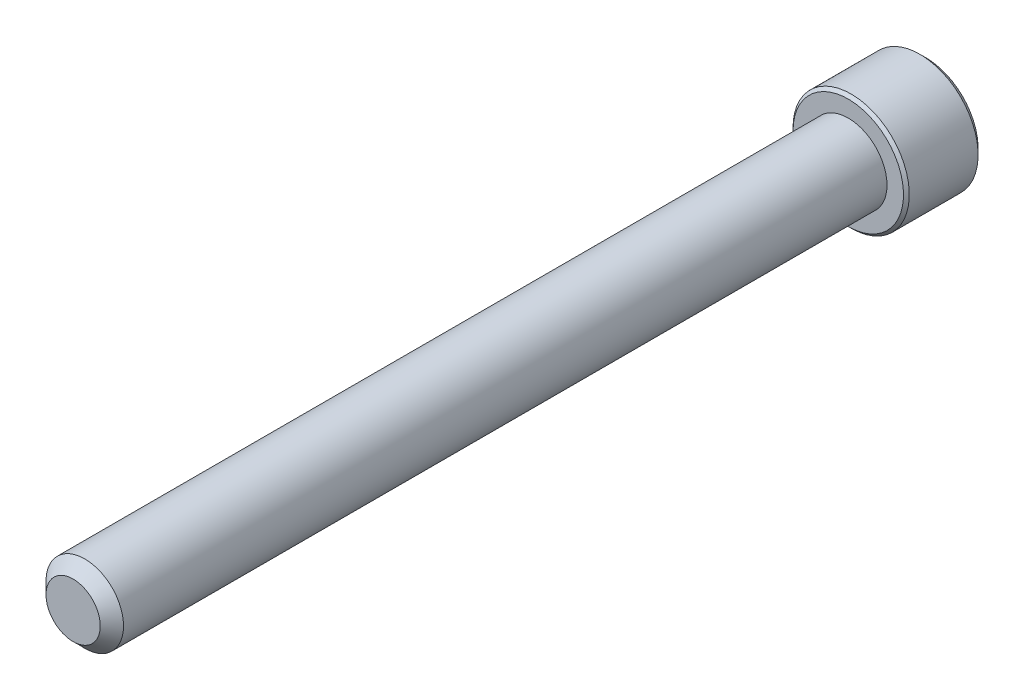
ISO-10303-21;
HEADER;
FILE_DESCRIPTION(('STEP AP214'),'2;1');
FILE_NAME('part.step','',(''),(''),'','','');
FILE_SCHEMA(('AUTOMOTIVE_DESIGN { 1 0 10303 214 1 1 1 1 }'));
ENDSEC;
DATA;
#1=APPLICATION_CONTEXT('core data for automotive mechanical design processes');
#2=APPLICATION_PROTOCOL_DEFINITION('international standard','automotive_design',2000,#1);
#3=PRODUCT_CONTEXT('',#1,'mechanical');
#4=PRODUCT('Part','Part','',(#3));
#5=PRODUCT_RELATED_PRODUCT_CATEGORY('part','',(#4));
#6=PRODUCT_DEFINITION_FORMATION('','',#4);
#7=PRODUCT_DEFINITION_CONTEXT('part definition',#1,'design');
#8=PRODUCT_DEFINITION('design','',#6,#7);
#9=PRODUCT_DEFINITION_SHAPE('','',#8);
#10=(LENGTH_UNIT() NAMED_UNIT(*) SI_UNIT(.MILLI.,.METRE.));
#11=(NAMED_UNIT(*) PLANE_ANGLE_UNIT() SI_UNIT($,.RADIAN.));
#12=(NAMED_UNIT(*) SI_UNIT($,.STERADIAN.) SOLID_ANGLE_UNIT());
#13=UNCERTAINTY_MEASURE_WITH_UNIT(LENGTH_MEASURE(1.E-05),#10,'distance_accuracy_value','');
#14=(GEOMETRIC_REPRESENTATION_CONTEXT(3) GLOBAL_UNCERTAINTY_ASSIGNED_CONTEXT((#13)) GLOBAL_UNIT_ASSIGNED_CONTEXT((#10,
#11,#12)) REPRESENTATION_CONTEXT('',''));
#15=CARTESIAN_POINT('',(0.,0.,0.));
#16=DIRECTION('',(0.,0.,1.));
#17=DIRECTION('',(1.,0.,0.));
#18=AXIS2_PLACEMENT_3D('',#15,#16,#17);
#19=CARTESIAN_POINT('',(0.,0.,-63.5));
#20=DIRECTION('',(0.,0.,1.));
#21=DIRECTION('',(1.,0.,0.));
#22=AXIS2_PLACEMENT_3D('',#19,#20,#21);
#23=CYLINDRICAL_SURFACE('',#22,3.175);
#24=CARTESIAN_POINT('',(0.,0.,-0.952499999999995));
#25=DIRECTION('',(0.,0.,1.));
#26=DIRECTION('',(1.,0.,0.));
#27=AXIS2_PLACEMENT_3D('',#24,#25,#26);
#28=CIRCLE('',#27,3.175);
#29=CARTESIAN_POINT('',(3.175,0.,-0.952499999999995));
#30=VERTEX_POINT('',#29);
#31=EDGE_CURVE('E113',#30,#30,#28,.F.);
#32=ORIENTED_EDGE('',*,*,#31,.T.);
#33=EDGE_LOOP('',(#32));
#34=FACE_BOUND('',#33,.T.);
#35=CARTESIAN_POINT('',(0.,0.,-63.5));
#36=DIRECTION('',(0.,0.,-1.));
#37=DIRECTION('',(-1.,0.,0.));
#38=AXIS2_PLACEMENT_3D('',#35,#36,#37);
#39=CIRCLE('',#38,3.175);
#40=CARTESIAN_POINT('',(-3.175,0.,-63.5));
#41=VERTEX_POINT('',#40);
#42=EDGE_CURVE('E218',#41,#41,#39,.F.);
#43=ORIENTED_EDGE('',*,*,#42,.T.);
#44=EDGE_LOOP('',(#43));
#45=FACE_BOUND('',#44,.T.);
#46=ADVANCED_FACE('F39',(#34,#45),#23,.T.);
#47=CARTESIAN_POINT('',(0.,0.,0.));
#48=DIRECTION('',(0.,0.,1.));
#49=DIRECTION('',(1.,0.,0.));
#50=AXIS2_PLACEMENT_3D('',#47,#48,#49);
#51=PLANE('',#50);
#52=CARTESIAN_POINT('',(0.,0.,0.));
#53=DIRECTION('',(0.,0.,1.));
#54=DIRECTION('',(1.,0.,0.));
#55=AXIS2_PLACEMENT_3D('',#52,#53,#54);
#56=CIRCLE('',#55,2.22250000000001);
#57=CARTESIAN_POINT('',(2.22250000000001,0.,0.));
#58=VERTEX_POINT('',#57);
#59=EDGE_CURVE('E217',#58,#58,#56,.T.);
#60=ORIENTED_EDGE('',*,*,#59,.T.);
#61=EDGE_LOOP('',(#60));
#62=FACE_BOUND('',#61,.T.);
#63=ADVANCED_FACE('F194',(#62),#51,.T.);
#64=CARTESIAN_POINT('',(0.,0.,0.));
#65=DIRECTION('',(0.,0.,-1.));
#66=DIRECTION('',(-1.,0.,0.));
#67=AXIS2_PLACEMENT_3D('',#64,#65,#66);
#68=CONICAL_SURFACE('',#67,2.22250000000001,0.785398163397446);
#69=ORIENTED_EDGE('',*,*,#31,.F.);
#70=EDGE_LOOP('',(#69));
#71=FACE_BOUND('',#70,.T.);
#72=ORIENTED_EDGE('',*,*,#59,.F.);
#73=EDGE_LOOP('',(#72));
#74=FACE_BOUND('',#73,.T.);
#75=ADVANCED_FACE('F200',(#71,#74),#68,.T.);
#76=CARTESIAN_POINT('',(0.,0.,-69.85));
#77=DIRECTION('',(0.,0.,1.));
#78=DIRECTION('',(1.,0.,0.));
#79=AXIS2_PLACEMENT_3D('',#76,#77,#78);
#80=CYLINDRICAL_SURFACE('',#79,4.7625);
#81=CARTESIAN_POINT('',(0.,0.,-63.738125));
#82=DIRECTION('',(0.,0.,-1.));
#83=DIRECTION('',(-1.,0.,0.));
#84=AXIS2_PLACEMENT_3D('',#81,#82,#83);
#85=CIRCLE('',#84,4.7625);
#86=CARTESIAN_POINT('',(-4.7625,0.,-63.738125));
#87=VERTEX_POINT('',#86);
#88=EDGE_CURVE('E47',#87,#87,#85,.T.);
#89=ORIENTED_EDGE('',*,*,#88,.T.);
#90=EDGE_LOOP('',(#89));
#91=FACE_BOUND('',#90,.T.);
#92=CARTESIAN_POINT('',(0.,0.,-69.37375));
#93=DIRECTION('',(0.,0.,-1.));
#94=DIRECTION('',(-1.,0.,0.));
#95=AXIS2_PLACEMENT_3D('',#92,#93,#94);
#96=CIRCLE('',#95,4.7625);
#97=CARTESIAN_POINT('',(-4.7625,0.,-69.37375));
#98=VERTEX_POINT('',#97);
#99=EDGE_CURVE('E176',#98,#98,#96,.F.);
#100=ORIENTED_EDGE('',*,*,#99,.T.);
#101=EDGE_LOOP('',(#100));
#102=FACE_BOUND('',#101,.T.);
#103=ADVANCED_FACE('F181',(#91,#102),#80,.T.);
#104=CARTESIAN_POINT('',(0.,0.,-69.85));
#105=DIRECTION('',(0.,0.,-1.));
#106=DIRECTION('',(-1.,0.,0.));
#107=AXIS2_PLACEMENT_3D('',#104,#105,#106);
#108=PLANE('',#107);
#109=CARTESIAN_POINT('',(0.,0.,-69.85));
#110=DIRECTION('',(0.,0.,-1.));
#111=DIRECTION('',(-1.,0.,0.));
#112=AXIS2_PLACEMENT_3D('',#109,#110,#111);
#113=CIRCLE('',#112,4.28624999999999);
#114=CARTESIAN_POINT('',(-4.28624999999999,0.,-69.85));
#115=VERTEX_POINT('',#114);
#116=EDGE_CURVE('E112',#115,#115,#113,.T.);
#117=ORIENTED_EDGE('',*,*,#116,.T.);
#118=EDGE_LOOP('',(#117));
#119=FACE_BOUND('',#118,.T.);
#120=CARTESIAN_POINT('',(0.,0.,-69.85));
#121=DIRECTION('',(0.,0.,-1.));
#122=DIRECTION('',(-1.,0.,0.));
#123=AXIS2_PLACEMENT_3D('',#120,#121,#122);
#124=CIRCLE('',#123,2.74963065701559);
#125=CARTESIAN_POINT('',(-2.38125,1.37481532850779,-69.85));
#126=VERTEX_POINT('',#125);
#127=CARTESIAN_POINT('',(0.,2.74963065701559,-69.85));
#128=VERTEX_POINT('',#127);
#129=EDGE_CURVE('E93',#126,#128,#124,.T.);
#130=ORIENTED_EDGE('',*,*,#129,.F.);
#131=CARTESIAN_POINT('',(-2.38125,-1.3748153285078,-69.85));
#132=VERTEX_POINT('',#131);
#133=EDGE_CURVE('E53',#132,#126,#124,.T.);
#134=ORIENTED_EDGE('',*,*,#133,.F.);
#135=CARTESIAN_POINT('',(0.,-2.74963065701559,-69.85));
#136=VERTEX_POINT('',#135);
#137=EDGE_CURVE('E277',#136,#132,#124,.T.);
#138=ORIENTED_EDGE('',*,*,#137,.F.);
#139=CARTESIAN_POINT('',(2.38125,-1.3748153285078,-69.85));
#140=VERTEX_POINT('',#139);
#141=EDGE_CURVE('E60',#140,#136,#124,.T.);
#142=ORIENTED_EDGE('',*,*,#141,.F.);
#143=CARTESIAN_POINT('',(2.38125,1.3748153285078,-69.85));
#144=VERTEX_POINT('',#143);
#145=EDGE_CURVE('E134',#144,#140,#124,.T.);
#146=ORIENTED_EDGE('',*,*,#145,.F.);
#147=EDGE_CURVE('E102',#128,#144,#124,.T.);
#148=ORIENTED_EDGE('',*,*,#147,.F.);
#149=EDGE_LOOP('',(#130,#134,#138,#142,#146,#148));
#150=FACE_BOUND('',#149,.T.);
#151=ADVANCED_FACE('F133',(#119,#150),#108,.T.);
#152=CARTESIAN_POINT('',(0.,0.,-63.5));
#153=DIRECTION('',(0.,0.,-1.));
#154=DIRECTION('',(-1.,0.,0.));
#155=AXIS2_PLACEMENT_3D('',#152,#153,#154);
#156=PLANE('',#155);
#157=CARTESIAN_POINT('',(0.,0.,-63.5));
#158=DIRECTION('',(0.,0.,-1.));
#159=DIRECTION('',(-1.,0.,0.));
#160=AXIS2_PLACEMENT_3D('',#157,#158,#159);
#161=CIRCLE('',#160,4.524375);
#162=CARTESIAN_POINT('',(-4.524375,0.,-63.5));
#163=VERTEX_POINT('',#162);
#164=EDGE_CURVE('E11',#163,#163,#161,.F.);
#165=ORIENTED_EDGE('',*,*,#164,.T.);
#166=EDGE_LOOP('',(#165));
#167=FACE_BOUND('',#166,.T.);
#168=ORIENTED_EDGE('',*,*,#42,.F.);
#169=EDGE_LOOP('',(#168));
#170=FACE_BOUND('',#169,.T.);
#171=ADVANCED_FACE('F289',(#167,#170),#156,.F.);
#172=CARTESIAN_POINT('',(0.,0.,-69.85));
#173=DIRECTION('',(0.,0.,-1.));
#174=DIRECTION('',(-1.,0.,0.));
#175=AXIS2_PLACEMENT_3D('',#172,#173,#174);
#176=CONICAL_SURFACE('',#175,2.74963065701559,0.78539816339745);
#177=ORIENTED_EDGE('',*,*,#147,.T.);
#178=CARTESIAN_POINT('',(-0.000200000000001391,2.74974612706943,-69.8501154773272));
#179=CARTESIAN_POINT('',(0.0816567823790487,2.70248609172789,-69.8028948967095));
#180=CARTESIAN_POINT('',(0.164882333771758,2.65443579722785,-69.7584475752929));
#181=CARTESIAN_POINT('',(0.334588480838037,2.556455907536,-69.6770654569856));
#182=CARTESIAN_POINT('',(0.4210852173531,2.50651699342501,-69.6401759430951));
#183=CARTESIAN_POINT('',(0.59550177400904,2.40581754748857,-69.5769834131659));
#184=CARTESIAN_POINT('',(0.683377171180673,2.35508266327639,-69.5505215587295));
#185=CARTESIAN_POINT('',(0.861062594070874,2.25249593653966,-69.509751515616));
#186=CARTESIAN_POINT('',(0.950867191185869,2.20064722822085,-69.4954128915305));
#187=CARTESIAN_POINT('',(1.10563960313034,2.11128933452158,-69.4824757847701));
#188=CARTESIAN_POINT('',(1.17040744896962,2.07389560129144,-69.4805606046532));
#189=CARTESIAN_POINT('',(1.29983727933557,1.99916925388849,-69.4837866227677));
#190=CARTESIAN_POINT('',(1.36449921879335,1.96183666573622,-69.4889302948571));
#191=CARTESIAN_POINT('',(1.4932125485774,1.88752399013711,-69.5059813108716));
#192=CARTESIAN_POINT('',(1.55726317423485,1.85054434417201,-69.5178962213493));
#193=CARTESIAN_POINT('',(1.68425683890527,1.77722451768917,-69.547835672352));
#194=CARTESIAN_POINT('',(1.74719996243582,1.74088428837517,-69.5658597445184));
#195=CARTESIAN_POINT('',(1.90842615073218,1.64780030516185,-69.6193688075524));
#196=CARTESIAN_POINT('',(2.00570949128784,1.59163374230437,-69.6588874208722));
#197=CARTESIAN_POINT('',(2.14875606262558,1.50904576583588,-69.7256003435508));
#198=CARTESIAN_POINT('',(2.19589628894397,1.48182934348129,-69.7490402091113));
#199=CARTESIAN_POINT('',(2.28930352636665,1.42790064981105,-69.7980566766595));
#200=CARTESIAN_POINT('',(2.33557105249683,1.40118808114505,-69.8236319667669));
#201=CARTESIAN_POINT('',(2.38145000000001,1.37469985845396,-69.8501154773272));
#202=B_SPLINE_CURVE_WITH_KNOTS('',3,(#178,#179,#180,#181,#182,#183,#184,#185,#186,#187,#188,
#189,#190,#191,#192,#193,#194,#195,#196,#197,#198,#199,#200,#201),.UNSPECIFIED.,.F.,.F.,(4,2,2,
2,2,2,2,2,2,2,2,4),(0.,0.317196610611946,0.636241461041219,0.950218950629224,1.26340583824126,
1.48752413747844,1.71172100167747,1.93616888974082,2.16059957440836,2.51709639744764,
2.694861473691,2.87251813383155),.UNSPECIFIED.);
#203=EDGE_CURVE('E107',#128,#144,#202,.T.);
#204=ORIENTED_EDGE('',*,*,#203,.F.);
#205=EDGE_LOOP('',(#177,#204));
#206=FACE_BOUND('',#205,.T.);
#207=ADVANCED_FACE('F108',(#206),#176,.F.);
#208=ORIENTED_EDGE('',*,*,#145,.T.);
#209=CARTESIAN_POINT('',(2.38125,-2.74194290589387,-70.7319808945799));
#210=CARTESIAN_POINT('',(2.38125,-2.6751796105604,-70.6815846679781));
#211=CARTESIAN_POINT('',(2.38125,-2.60804251112752,-70.6316755875907));
#212=CARTESIAN_POINT('',(2.38125,-2.47287325055307,-70.5330498309857));
#213=CARTESIAN_POINT('',(2.38125,-2.40484086895313,-70.4843334572448));
#214=CARTESIAN_POINT('',(2.38125,-2.26723593505441,-70.3879648544534));
#215=CARTESIAN_POINT('',(2.38125,-2.19765553346049,-70.3403237954326));
#216=CARTESIAN_POINT('',(2.38125,-2.05731367842203,-70.2468199233866));
#217=CARTESIAN_POINT('',(2.38125,-1.98655230892573,-70.2009569847287));
#218=CARTESIAN_POINT('',(2.38125,-1.83957751909225,-70.1088459007133));
#219=CARTESIAN_POINT('',(2.38125,-1.76328361992075,-70.0627255173928));
#220=CARTESIAN_POINT('',(2.38125,-1.6089135770446,-69.9735183038905));
#221=CARTESIAN_POINT('',(2.38125,-1.53083712149137,-69.9304320099754));
#222=CARTESIAN_POINT('',(2.38125,-1.37291620334514,-69.8482265014712));
#223=CARTESIAN_POINT('',(2.38125,-1.29307799938227,-69.8090953578519));
#224=CARTESIAN_POINT('',(2.38125,-1.13121425093132,-69.7356679503151));
#225=CARTESIAN_POINT('',(2.38125,-1.04918943681795,-69.7013700954537));
#226=CARTESIAN_POINT('',(2.38125,-0.88953525675927,-69.6413546314156));
#227=CARTESIAN_POINT('',(2.38125,-0.812083865770253,-69.615168478432));
#228=CARTESIAN_POINT('',(2.38125,-0.655316366527654,-69.5690097514868));
#229=CARTESIAN_POINT('',(2.38125,-0.576000130216824,-69.5490376055837));
#230=CARTESIAN_POINT('',(2.38125,-0.417295761573368,-69.5166821452488));
#231=CARTESIAN_POINT('',(2.38125,-0.337934576883839,-69.5041688083547));
#232=CARTESIAN_POINT('',(2.38125,-0.178363852969575,-69.4869738601659));
#233=CARTESIAN_POINT('',(2.38125,-0.0981544619617589,-69.4822909026126));
#234=CARTESIAN_POINT('',(2.38125,0.0594188034321368,-69.4811044408392));
#235=CARTESIAN_POINT('',(2.38125,0.136780588526,-69.4843110105046));
#236=CARTESIAN_POINT('',(2.38125,0.290840960607345,-69.4980870567428));
#237=CARTESIAN_POINT('',(2.38125,0.367539482435415,-69.5086572485871));
#238=CARTESIAN_POINT('',(2.38125,0.521017492835394,-69.5367628298525));
#239=CARTESIAN_POINT('',(2.38125,0.597774958394055,-69.5544167489315));
#240=CARTESIAN_POINT('',(2.38125,0.749609814257014,-69.5957513962434));
#241=CARTESIAN_POINT('',(2.38125,0.824687344568029,-69.6194316201904));
#242=CARTESIAN_POINT('',(2.38125,1.06107814410025,-69.702894862956));
#243=CARTESIAN_POINT('',(2.38125,1.2190478622181,-69.7721839270396));
#244=CARTESIAN_POINT('',(2.38125,1.45021000267342,-69.8876640838597));
#245=CARTESIAN_POINT('',(2.38125,1.52644290442585,-69.9281730572583));
#246=CARTESIAN_POINT('',(2.38125,1.67717618538173,-70.0123026892371));
#247=CARTESIAN_POINT('',(2.38125,1.7516768735884,-70.0559227870999));
#248=CARTESIAN_POINT('',(2.38125,1.89548152088328,-70.143412556489));
#249=CARTESIAN_POINT('',(2.38125,1.96485959609,-70.1871617927418));
#250=CARTESIAN_POINT('',(2.38125,2.1024262441117,-70.2765011587307));
#251=CARTESIAN_POINT('',(2.38125,2.17061472626635,-70.3220914279041));
#252=CARTESIAN_POINT('',(2.38125,2.30540317317355,-70.4144060050932));
#253=CARTESIAN_POINT('',(2.38125,2.37201154222168,-70.4611180928962));
#254=CARTESIAN_POINT('',(2.38125,2.5043180005446,-70.5557775780183));
#255=CARTESIAN_POINT('',(2.38125,2.57001633510793,-70.6037246320963));
#256=CARTESIAN_POINT('',(2.38125,2.63533378855947,-70.6521767335425));
#257=B_SPLINE_CURVE_WITH_KNOTS('',3,(#209,#210,#211,#212,#213,#214,#215,#216,#217,#218,#219,
#220,#221,#222,#223,#224,#225,#226,#227,#228,#229,#230,#231,#232,#233,#234,#235,#236,#237,#238,
#239,#240,#241,#242,#243,#244,#245,#246,#247,#248,#249,#250,#251,#252,#253,#254,#255,#256),
.UNSPECIFIED.,.F.,.F.,(4,2,2,2,2,2,2,2,2,2,2,2,2,2,2,2,2,2,2,2,2,2,2,4),(0.,0.25095128400999,
0.501965564827882,0.754924775973594,1.00786608164542,1.27526207798893,1.54270521780083,
1.8093160202934,2.0758388581252,2.32089852590465,2.56597507114537,2.80664400307699,
3.04727155311266,3.27918940971452,3.51112979698763,3.74712477407484,3.98310000940112,
4.49898139184705,4.75794323931355,5.01685853149448,5.26288960015363,5.50893933794675,
5.75299038397143,5.99697431627971),.UNSPECIFIED.);
#258=EDGE_CURVE('E101',#144,#140,#257,.F.);
#259=ORIENTED_EDGE('',*,*,#258,.F.);
#260=EDGE_LOOP('',(#208,#259));
#261=FACE_BOUND('',#260,.T.);
#262=ADVANCED_FACE('F283',(#261),#176,.F.);
#263=ORIENTED_EDGE('',*,*,#141,.T.);
#264=CARTESIAN_POINT('',(2.38145,-1.37469985845396,-69.8501154773272));
#265=CARTESIAN_POINT('',(2.29959321762095,-1.4219598937955,-69.8028948967095));
#266=CARTESIAN_POINT('',(2.21636766622824,-1.47001018829554,-69.7584475752929));
#267=CARTESIAN_POINT('',(2.04666151916196,-1.56799007798739,-69.6770654569856));
#268=CARTESIAN_POINT('',(1.9601647826469,-1.61792899209838,-69.6401759430951));
#269=CARTESIAN_POINT('',(1.78574822599096,-1.71862843803482,-69.5769834131659));
#270=CARTESIAN_POINT('',(1.69787282881933,-1.769363322247,-69.5505215587295));
#271=CARTESIAN_POINT('',(1.52018740592913,-1.87195004898373,-69.509751515616));
#272=CARTESIAN_POINT('',(1.43038280881413,-1.92379875730254,-69.4954128915305));
#273=CARTESIAN_POINT('',(1.27561039686966,-2.01315665100181,-69.4824757847701));
#274=CARTESIAN_POINT('',(1.21084255103038,-2.05055038423195,-69.4805606046532));
#275=CARTESIAN_POINT('',(1.08141272066443,-2.1252767316349,-69.4837866227677));
#276=CARTESIAN_POINT('',(1.01675078120665,-2.16260931978717,-69.4889302948571));
#277=CARTESIAN_POINT('',(0.888037451422604,-2.23692199538628,-69.5059813108716));
#278=CARTESIAN_POINT('',(0.823986825765146,-2.27390164135138,-69.5178962213493));
#279=CARTESIAN_POINT('',(0.696993161094727,-2.34722146783422,-69.547835672352));
#280=CARTESIAN_POINT('',(0.634050037564176,-2.38356169714822,-69.5658597445184));
#281=CARTESIAN_POINT('',(0.472823849267818,-2.47664568036154,-69.6193688075524));
#282=CARTESIAN_POINT('',(0.375540508712157,-2.53281224321902,-69.6588874208722));
#283=CARTESIAN_POINT('',(0.232493937374425,-2.61540021968751,-69.7256003435508));
#284=CARTESIAN_POINT('',(0.18535371105603,-2.6426166420421,-69.7490402091113));
#285=CARTESIAN_POINT('',(0.0919464736333562,-2.69654533571234,-69.7980566766595));
#286=CARTESIAN_POINT('',(0.0456789475031741,-2.72325790437834,-69.8236319667669));
#287=CARTESIAN_POINT('',(-0.000200000000004731,-2.74974612706943,-69.8501154773272));
#288=B_SPLINE_CURVE_WITH_KNOTS('',3,(#264,#265,#266,#267,#268,#269,#270,#271,#272,#273,#274,
#275,#276,#277,#278,#279,#280,#281,#282,#283,#284,#285,#286,#287),.UNSPECIFIED.,.F.,.F.,(4,2,2,
2,2,2,2,2,2,2,2,4),(0.,0.317196610611947,0.636241461041219,0.950218950629224,1.26340583824126,
1.48752413747844,1.71172100167747,1.93616888974082,2.16059957440836,2.51709639744764,
2.694861473691,2.87251813383155),.UNSPECIFIED.);
#289=EDGE_CURVE('E144',#140,#136,#288,.T.);
#290=ORIENTED_EDGE('',*,*,#289,.F.);
#291=EDGE_LOOP('',(#263,#290));
#292=FACE_BOUND('',#291,.T.);
#293=ADVANCED_FACE('F280',(#292),#176,.F.);
#294=ORIENTED_EDGE('',*,*,#137,.T.);
#295=CARTESIAN_POINT('',(0.000200000000002323,-2.74974612706943,-69.8501154773272));
#296=CARTESIAN_POINT('',(-0.0816567823790478,-2.70248609172789,-69.8028948967095));
#297=CARTESIAN_POINT('',(-0.164882333771757,-2.65443579722786,-69.7584475752929));
#298=CARTESIAN_POINT('',(-0.334588480838036,-2.556455907536,-69.6770654569856));
#299=CARTESIAN_POINT('',(-0.421085217353099,-2.50651699342501,-69.6401759430951));
#300=CARTESIAN_POINT('',(-0.595501774009039,-2.40581754748857,-69.5769834131659));
#301=CARTESIAN_POINT('',(-0.683377171180672,-2.35508266327639,-69.5505215587295));
#302=CARTESIAN_POINT('',(-0.861062594070874,-2.25249593653966,-69.509751515616));
#303=CARTESIAN_POINT('',(-0.950867191185869,-2.20064722822085,-69.4954128915305));
#304=CARTESIAN_POINT('',(-1.10563960313034,-2.11128933452158,-69.4824757847701));
#305=CARTESIAN_POINT('',(-1.17040744896962,-2.07389560129144,-69.4805606046532));
#306=CARTESIAN_POINT('',(-1.29983727933557,-1.99916925388849,-69.4837866227677));
#307=CARTESIAN_POINT('',(-1.36449921879335,-1.96183666573622,-69.4889302948571));
#308=CARTESIAN_POINT('',(-1.4932125485774,-1.88752399013711,-69.5059813108716));
#309=CARTESIAN_POINT('',(-1.55726317423485,-1.85054434417201,-69.5178962213493));
#310=CARTESIAN_POINT('',(-1.68425683890527,-1.77722451768917,-69.547835672352));
#311=CARTESIAN_POINT('',(-1.74719996243582,-1.74088428837517,-69.5658597445184));
#312=CARTESIAN_POINT('',(-1.90842615073218,-1.64780030516185,-69.6193688075524));
#313=CARTESIAN_POINT('',(-2.00570949128784,-1.59163374230437,-69.6588874208722));
#314=CARTESIAN_POINT('',(-2.14875606262558,-1.50904576583588,-69.7256003435508));
#315=CARTESIAN_POINT('',(-2.19589628894397,-1.48182934348129,-69.7490402091113));
#316=CARTESIAN_POINT('',(-2.28930352636665,-1.42790064981105,-69.7980566766595));
#317=CARTESIAN_POINT('',(-2.33557105249683,-1.40118808114505,-69.8236319667669));
#318=CARTESIAN_POINT('',(-2.38145000000001,-1.37469985845396,-69.8501154773272));
#319=B_SPLINE_CURVE_WITH_KNOTS('',3,(#295,#296,#297,#298,#299,#300,#301,#302,#303,#304,#305,
#306,#307,#308,#309,#310,#311,#312,#313,#314,#315,#316,#317,#318),.UNSPECIFIED.,.F.,.F.,(4,2,2,
2,2,2,2,2,2,2,2,4),(0.,0.317196610611947,0.636241461041219,0.950218950629224,1.26340583824126,
1.48752413747844,1.71172100167747,1.93616888974082,2.16059957440836,2.51709639744764,
2.69486147369101,2.87251813383155),.UNSPECIFIED.);
#320=EDGE_CURVE('E254',#136,#132,#319,.T.);
#321=ORIENTED_EDGE('',*,*,#320,.F.);
#322=EDGE_LOOP('',(#294,#321));
#323=FACE_BOUND('',#322,.T.);
#324=ADVANCED_FACE('F279',(#323),#176,.F.);
#325=ORIENTED_EDGE('',*,*,#133,.T.);
#326=CARTESIAN_POINT('',(-2.38125,-2.7419429062928,-70.7319808948811));
#327=CARTESIAN_POINT('',(-2.38125,-2.67517961094813,-70.6815846682677));
#328=CARTESIAN_POINT('',(-2.38125,-2.60804251150403,-70.6316755878687));
#329=CARTESIAN_POINT('',(-2.38125,-2.47287325090701,-70.5330498312406));
#330=CARTESIAN_POINT('',(-2.38125,-2.40484086929573,-70.4843334574882));
#331=CARTESIAN_POINT('',(-2.38125,-2.26723593537395,-70.3879648546737));
#332=CARTESIAN_POINT('',(-2.38125,-2.1976555337683,-70.3403237956413));
#333=CARTESIAN_POINT('',(-2.38125,-2.05731367870617,-70.2468199235723));
#334=CARTESIAN_POINT('',(-2.38125,-1.98655230919793,-70.200956984903));
#335=CARTESIAN_POINT('',(-2.38125,-1.83957751933871,-70.1088459008639));
#336=CARTESIAN_POINT('',(-2.38125,-1.76328362015337,-70.0627255175311));
#337=CARTESIAN_POINT('',(-2.38125,-1.60891357724903,-69.9735183040048));
#338=CARTESIAN_POINT('',(-2.38125,-1.53083712168146,-69.930432010078));
#339=CARTESIAN_POINT('',(-2.38125,-1.37291620350604,-69.8482265015513));
#340=CARTESIAN_POINT('',(-2.38125,-1.29307799952833,-69.8090953579213));
#341=CARTESIAN_POINT('',(-2.38125,-1.13121425104687,-69.7356679503644));
#342=CARTESIAN_POINT('',(-2.38125,-1.04918943691786,-69.7013700954936));
#343=CARTESIAN_POINT('',(-2.38125,-0.889535256852411,-69.6413546314484));
#344=CARTESIAN_POINT('',(-2.38125,-0.812083865872971,-69.6151684784655));
#345=CARTESIAN_POINT('',(-2.38125,-0.655316366649834,-69.5690097515196));
#346=CARTESIAN_POINT('',(-2.38125,-0.576000130348889,-69.5490376056151));
#347=CARTESIAN_POINT('',(-2.38125,-0.417295761724879,-69.5166821452753));
#348=CARTESIAN_POINT('',(-2.38125,-0.337934577044905,-69.5041688083777));
#349=CARTESIAN_POINT('',(-2.38125,-0.178363853149431,-69.4869738601797));
#350=CARTESIAN_POINT('',(-2.38125,-0.0981544621508488,-69.4822909026206));
#351=CARTESIAN_POINT('',(-2.38125,0.0594188032260096,-69.4811044408343));
#352=CARTESIAN_POINT('',(-2.38125,0.136780588312046,-69.4843110104925));
#353=CARTESIAN_POINT('',(-2.38125,0.290840960378521,-69.4980870567153));
#354=CARTESIAN_POINT('',(-2.38125,0.367539482199548,-69.5086572485512));
#355=CARTESIAN_POINT('',(-2.38125,0.521017492585622,-69.5367628297993));
#356=CARTESIAN_POINT('',(-2.38125,0.597774958137442,-69.5544167488691));
#357=CARTESIAN_POINT('',(-2.38125,0.749609813987384,-69.5957513961625));
#358=CARTESIAN_POINT('',(-2.38125,0.824687344292223,-69.6194316201001));
#359=CARTESIAN_POINT('',(-2.38125,1.06107814376439,-69.7028948628217));
#360=CARTESIAN_POINT('',(-2.38125,1.21904786183135,-69.7721839268647));
#361=CARTESIAN_POINT('',(-2.38125,1.4502100022134,-69.8876640836207));
#362=CARTESIAN_POINT('',(-2.38125,1.52644290394183,-69.9281730569973));
#363=CARTESIAN_POINT('',(-2.38125,1.6771761848505,-70.0123026889314));
#364=CARTESIAN_POINT('',(-2.38125,1.75167687303396,-70.0559227867715));
#365=CARTESIAN_POINT('',(-2.38125,1.89548152028664,-70.1434125561176));
#366=CARTESIAN_POINT('',(-2.38125,1.96485959547429,-70.18716179235));
#367=CARTESIAN_POINT('',(-2.38125,2.10242624345814,-70.2765011582982));
#368=CARTESIAN_POINT('',(-2.38125,2.170614725594,-70.3220914274512));
#369=CARTESIAN_POINT('',(-2.38125,2.30540317246408,-70.4144060045998));
#370=CARTESIAN_POINT('',(-2.38125,2.37201154149387,-70.4611180923826));
#371=CARTESIAN_POINT('',(-2.38125,2.50431799978025,-70.5557775774644));
#372=CARTESIAN_POINT('',(-2.38125,2.57001633432536,-70.6037246315223));
#373=CARTESIAN_POINT('',(-2.38125,2.63533378775872,-70.6521767329484));
#374=B_SPLINE_CURVE_WITH_KNOTS('',3,(#326,#327,#328,#329,#330,#331,#332,#333,#334,#335,#336,
#337,#338,#339,#340,#341,#342,#343,#344,#345,#346,#347,#348,#349,#350,#351,#352,#353,#354,#355,
#356,#357,#358,#359,#360,#361,#362,#363,#364,#365,#366,#367,#368,#369,#370,#371,#372,#373),
.UNSPECIFIED.,.F.,.F.,(4,2,2,2,2,2,2,2,2,2,2,2,2,2,2,2,2,2,2,2,2,2,2,4),(0.,0.250951284057751,
0.501965564923431,0.754924776117824,1.00786608183831,1.2752620782364,1.54270521810291,
1.80931602064963,2.07583885853551,2.32089852628727,2.56597507150036,2.80664400340548,
3.04727155341464,3.27918940999225,3.51112979724108,3.74712477430215,3.98310000960232,
4.49898139186045,4.75794323923239,5.01685853131883,5.2628895998971,5.50893933760934,
5.75299038355427,5.9969743157828),.UNSPECIFIED.);
#375=EDGE_CURVE('E123',#132,#126,#374,.T.);
#376=ORIENTED_EDGE('',*,*,#375,.F.);
#377=EDGE_LOOP('',(#325,#376));
#378=FACE_BOUND('',#377,.T.);
#379=ADVANCED_FACE('F295',(#378),#176,.F.);
#380=ORIENTED_EDGE('',*,*,#129,.T.);
#381=CARTESIAN_POINT('',(-2.38145,1.37469985845396,-69.8501154773272));
#382=CARTESIAN_POINT('',(-2.29959321762095,1.4219598937955,-69.8028948967095));
#383=CARTESIAN_POINT('',(-2.21636766622824,1.47001018829553,-69.7584475752929));
#384=CARTESIAN_POINT('',(-2.04666151916196,1.56799007798738,-69.6770654569856));
#385=CARTESIAN_POINT('',(-1.9601647826469,1.61792899209838,-69.6401759430951));
#386=CARTESIAN_POINT('',(-1.78574822599096,1.71862843803482,-69.5769834131659));
#387=CARTESIAN_POINT('',(-1.69787282881932,1.769363322247,-69.5505215587295));
#388=CARTESIAN_POINT('',(-1.52018740592912,1.87195004898373,-69.509751515616));
#389=CARTESIAN_POINT('',(-1.43038280881413,1.92379875730254,-69.4954128915305));
#390=CARTESIAN_POINT('',(-1.27561039686966,2.01315665100181,-69.4824757847701));
#391=CARTESIAN_POINT('',(-1.21084255103038,2.05055038423195,-69.4805606046532));
#392=CARTESIAN_POINT('',(-1.08141272066442,2.1252767316349,-69.4837866227677));
#393=CARTESIAN_POINT('',(-1.01675078120664,2.16260931978718,-69.4889302948571));
#394=CARTESIAN_POINT('',(-0.888037451422599,2.23692199538629,-69.5059813108716));
#395=CARTESIAN_POINT('',(-0.823986825765141,2.27390164135138,-69.5178962213493));
#396=CARTESIAN_POINT('',(-0.696993161094721,2.34722146783423,-69.547835672352));
#397=CARTESIAN_POINT('',(-0.634050037564171,2.38356169714823,-69.5658597445184));
#398=CARTESIAN_POINT('',(-0.472823849267813,2.47664568036155,-69.6193688075524));
#399=CARTESIAN_POINT('',(-0.375540508712153,2.53281224321902,-69.6588874208722));
#400=CARTESIAN_POINT('',(-0.232493937374422,2.61540021968751,-69.7256003435508));
#401=CARTESIAN_POINT('',(-0.185353711056027,2.6426166420421,-69.7490402091113));
#402=CARTESIAN_POINT('',(-0.0919464736333539,2.69654533571234,-69.7980566766595));
#403=CARTESIAN_POINT('',(-0.0456789475031721,2.72325790437834,-69.8236319667669));
#404=CARTESIAN_POINT('',(0.000200000000006315,2.74974612706943,-69.8501154773272));
#405=B_SPLINE_CURVE_WITH_KNOTS('',3,(#381,#382,#383,#384,#385,#386,#387,#388,#389,#390,#391,
#392,#393,#394,#395,#396,#397,#398,#399,#400,#401,#402,#403,#404),.UNSPECIFIED.,.F.,.F.,(4,2,2,
2,2,2,2,2,2,2,2,4),(0.,0.317196610611948,0.636241461041221,0.950218950629228,1.26340583824127,
1.48752413747845,1.71172100167748,1.93616888974083,2.16059957440837,2.51709639744764,
2.69486147369101,2.87251813383155),.UNSPECIFIED.);
#406=EDGE_CURVE('E97',#126,#128,#405,.T.);
#407=ORIENTED_EDGE('',*,*,#406,.F.);
#408=EDGE_LOOP('',(#380,#407));
#409=FACE_BOUND('',#408,.T.);
#410=ADVANCED_FACE('F95',(#409),#176,.F.);
#411=CARTESIAN_POINT('',(2.38125,4.12444598552339,-66.278125));
#412=DIRECTION('',(0.,0.,-1.));
#413=DIRECTION('',(-1.,0.,0.));
#414=AXIS2_PLACEMENT_3D('',#411,#412,#413);
#415=PLANE('',#414);
#416=DIRECTION('',(0.866025403784439,0.5,0.));
#417=VECTOR('',#416,1.);
#418=CARTESIAN_POINT('',(-2.38125,1.3748153285078,-66.278125));
#419=LINE('',#418,#417);
#420=CARTESIAN_POINT('',(-2.38125,1.3748153285078,-66.278125));
#421=VERTEX_POINT('',#420);
#422=CARTESIAN_POINT('',(0.,2.74963065701559,-66.278125));
#423=VERTEX_POINT('',#422);
#424=EDGE_CURVE('E122',#421,#423,#419,.T.);
#425=ORIENTED_EDGE('',*,*,#424,.T.);
#426=DIRECTION('',(0.866025403784439,-0.5,0.));
#427=VECTOR('',#426,1.);
#428=CARTESIAN_POINT('',(0.,2.74963065701559,-66.278125));
#429=LINE('',#428,#427);
#430=CARTESIAN_POINT('',(2.38125,1.3748153285078,-66.278125));
#431=VERTEX_POINT('',#430);
#432=EDGE_CURVE('E127',#423,#431,#429,.T.);
#433=ORIENTED_EDGE('',*,*,#432,.T.);
#434=DIRECTION('',(0.,-1.,0.));
#435=VECTOR('',#434,1.);
#436=CARTESIAN_POINT('',(2.38125,1.3748153285078,-66.278125));
#437=LINE('',#436,#435);
#438=CARTESIAN_POINT('',(2.38125,-1.3748153285078,-66.278125));
#439=VERTEX_POINT('',#438);
#440=EDGE_CURVE('E240',#431,#439,#437,.T.);
#441=ORIENTED_EDGE('',*,*,#440,.T.);
#442=DIRECTION('',(-0.866025403784439,-0.5,0.));
#443=VECTOR('',#442,1.);
#444=CARTESIAN_POINT('',(2.38125,-1.3748153285078,-66.278125));
#445=LINE('',#444,#443);
#446=CARTESIAN_POINT('',(0.,-2.74963065701559,-66.278125));
#447=VERTEX_POINT('',#446);
#448=EDGE_CURVE('E237',#439,#447,#445,.T.);
#449=ORIENTED_EDGE('',*,*,#448,.T.);
#450=DIRECTION('',(-0.866025403784439,0.5,0.));
#451=VECTOR('',#450,1.);
#452=CARTESIAN_POINT('',(0.,-2.74963065701559,-66.278125));
#453=LINE('',#452,#451);
#454=CARTESIAN_POINT('',(-2.38125,-1.3748153285078,-66.278125));
#455=VERTEX_POINT('',#454);
#456=EDGE_CURVE('E234',#447,#455,#453,.T.);
#457=ORIENTED_EDGE('',*,*,#456,.T.);
#458=DIRECTION('',(0.,1.,0.));
#459=VECTOR('',#458,1.);
#460=CARTESIAN_POINT('',(-2.38125,-1.3748153285078,-66.278125));
#461=LINE('',#460,#459);
#462=EDGE_CURVE('E130',#455,#421,#461,.T.);
#463=ORIENTED_EDGE('',*,*,#462,.T.);
#464=EDGE_LOOP('',(#425,#433,#441,#449,#457,#463));
#465=FACE_BOUND('',#464,.T.);
#466=ADVANCED_FACE('F164',(#465),#415,.T.);
#467=CARTESIAN_POINT('',(0.,2.74963065701559,-66.278125));
#468=DIRECTION('',(0.5,0.866025403784439,0.));
#469=DIRECTION('',(-0.866025403784439,0.5,0.));
#470=AXIS2_PLACEMENT_3D('',#467,#468,#469);
#471=PLANE('',#470);
#472=DIRECTION('',(0.,0.,-1.));
#473=VECTOR('',#472,1.);
#474=CARTESIAN_POINT('',(0.,2.74963065701559,-66.278125));
#475=LINE('',#474,#473);
#476=EDGE_CURVE('E119',#423,#128,#475,.T.);
#477=ORIENTED_EDGE('',*,*,#476,.T.);
#478=ORIENTED_EDGE('',*,*,#203,.T.);
#479=DIRECTION('',(0.,0.,-1.));
#480=VECTOR('',#479,1.);
#481=CARTESIAN_POINT('',(2.38125,1.3748153285078,-66.278125));
#482=LINE('',#481,#480);
#483=EDGE_CURVE('E129',#431,#144,#482,.T.);
#484=ORIENTED_EDGE('',*,*,#483,.F.);
#485=ORIENTED_EDGE('',*,*,#432,.F.);
#486=EDGE_LOOP('',(#477,#478,#484,#485));
#487=FACE_BOUND('',#486,.T.);
#488=ADVANCED_FACE('F125',(#487),#471,.F.);
#489=CARTESIAN_POINT('',(2.38125,1.3748153285078,-66.278125));
#490=DIRECTION('',(1.,0.,0.));
#491=DIRECTION('',(0.,1.,0.));
#492=AXIS2_PLACEMENT_3D('',#489,#490,#491);
#493=PLANE('',#492);
#494=ORIENTED_EDGE('',*,*,#483,.T.);
#495=ORIENTED_EDGE('',*,*,#258,.T.);
#496=DIRECTION('',(0.,0.,-1.));
#497=VECTOR('',#496,1.);
#498=CARTESIAN_POINT('',(2.38125,-1.3748153285078,-66.278125));
#499=LINE('',#498,#497);
#500=EDGE_CURVE('E223',#439,#140,#499,.T.);
#501=ORIENTED_EDGE('',*,*,#500,.F.);
#502=ORIENTED_EDGE('',*,*,#440,.F.);
#503=EDGE_LOOP('',(#494,#495,#501,#502));
#504=FACE_BOUND('',#503,.T.);
#505=ADVANCED_FACE('F153',(#504),#493,.F.);
#506=CARTESIAN_POINT('',(2.38125,-1.3748153285078,-66.278125));
#507=DIRECTION('',(0.5,-0.866025403784439,0.));
#508=DIRECTION('',(0.866025403784439,0.5,0.));
#509=AXIS2_PLACEMENT_3D('',#506,#507,#508);
#510=PLANE('',#509);
#511=ORIENTED_EDGE('',*,*,#500,.T.);
#512=ORIENTED_EDGE('',*,*,#289,.T.);
#513=DIRECTION('',(0.,0.,-1.));
#514=VECTOR('',#513,1.);
#515=CARTESIAN_POINT('',(0.,-2.74963065701559,-66.278125));
#516=LINE('',#515,#514);
#517=EDGE_CURVE('E226',#447,#136,#516,.T.);
#518=ORIENTED_EDGE('',*,*,#517,.F.);
#519=ORIENTED_EDGE('',*,*,#448,.F.);
#520=EDGE_LOOP('',(#511,#512,#518,#519));
#521=FACE_BOUND('',#520,.T.);
#522=ADVANCED_FACE('F157',(#521),#510,.F.);
#523=CARTESIAN_POINT('',(0.,-2.74963065701559,-66.278125));
#524=DIRECTION('',(-0.5,-0.866025403784439,0.));
#525=DIRECTION('',(0.866025403784439,-0.5,0.));
#526=AXIS2_PLACEMENT_3D('',#523,#524,#525);
#527=PLANE('',#526);
#528=ORIENTED_EDGE('',*,*,#517,.T.);
#529=ORIENTED_EDGE('',*,*,#320,.T.);
#530=DIRECTION('',(0.,0.,-1.));
#531=VECTOR('',#530,1.);
#532=CARTESIAN_POINT('',(-2.38125,-1.3748153285078,-66.278125));
#533=LINE('',#532,#531);
#534=EDGE_CURVE('E229',#455,#132,#533,.T.);
#535=ORIENTED_EDGE('',*,*,#534,.F.);
#536=ORIENTED_EDGE('',*,*,#456,.F.);
#537=EDGE_LOOP('',(#528,#529,#535,#536));
#538=FACE_BOUND('',#537,.T.);
#539=ADVANCED_FACE('F262',(#538),#527,.F.);
#540=CARTESIAN_POINT('',(-2.38125,-1.3748153285078,-66.278125));
#541=DIRECTION('',(-1.,0.,0.));
#542=DIRECTION('',(0.,-1.,0.));
#543=AXIS2_PLACEMENT_3D('',#540,#541,#542);
#544=PLANE('',#543);
#545=ORIENTED_EDGE('',*,*,#534,.T.);
#546=ORIENTED_EDGE('',*,*,#375,.T.);
#547=DIRECTION('',(0.,0.,-1.));
#548=VECTOR('',#547,1.);
#549=CARTESIAN_POINT('',(-2.38125,1.3748153285078,-66.278125));
#550=LINE('',#549,#548);
#551=EDGE_CURVE('E121',#421,#126,#550,.T.);
#552=ORIENTED_EDGE('',*,*,#551,.F.);
#553=ORIENTED_EDGE('',*,*,#462,.F.);
#554=EDGE_LOOP('',(#545,#546,#552,#553));
#555=FACE_BOUND('',#554,.T.);
#556=ADVANCED_FACE('F259',(#555),#544,.F.);
#557=CARTESIAN_POINT('',(-2.38125,1.3748153285078,-66.278125));
#558=DIRECTION('',(-0.5,0.866025403784439,0.));
#559=DIRECTION('',(-0.866025403784439,-0.5,0.));
#560=AXIS2_PLACEMENT_3D('',#557,#558,#559);
#561=PLANE('',#560);
#562=ORIENTED_EDGE('',*,*,#551,.T.);
#563=ORIENTED_EDGE('',*,*,#406,.T.);
#564=ORIENTED_EDGE('',*,*,#476,.F.);
#565=ORIENTED_EDGE('',*,*,#424,.F.);
#566=EDGE_LOOP('',(#562,#563,#564,#565));
#567=FACE_BOUND('',#566,.T.);
#568=ADVANCED_FACE('F117',(#567),#561,.F.);
#569=CARTESIAN_POINT('',(0.,0.,-69.85));
#570=DIRECTION('',(0.,0.,1.));
#571=DIRECTION('',(1.,0.,0.));
#572=AXIS2_PLACEMENT_3D('',#569,#570,#571);
#573=CONICAL_SURFACE('',#572,4.28624999999999,0.78539816339746);
#574=ORIENTED_EDGE('',*,*,#99,.F.);
#575=EDGE_LOOP('',(#574));
#576=FACE_BOUND('',#575,.T.);
#577=ORIENTED_EDGE('',*,*,#116,.F.);
#578=EDGE_LOOP('',(#577));
#579=FACE_BOUND('',#578,.T.);
#580=ADVANCED_FACE('F185',(#576,#579),#573,.T.);
#581=CARTESIAN_POINT('',(0.,0.,-63.738125));
#582=DIRECTION('',(0.,0.,-1.));
#583=DIRECTION('',(-1.,0.,0.));
#584=AXIS2_PLACEMENT_3D('',#581,#582,#583);
#585=CONICAL_SURFACE('',#584,4.7625,0.785398163397457);
#586=ORIENTED_EDGE('',*,*,#164,.F.);
#587=EDGE_LOOP('',(#586));
#588=FACE_BOUND('',#587,.T.);
#589=ORIENTED_EDGE('',*,*,#88,.F.);
#590=EDGE_LOOP('',(#589));
#591=FACE_BOUND('',#590,.T.);
#592=ADVANCED_FACE('F41',(#588,#591),#585,.T.);
#593=CLOSED_SHELL('',(#46,#63,#75,#103,#151,#171,#207,#262,#293,#324,#379,#410,#466,#488,#505,
#522,#539,#556,#568,#580,#592));
#594=MANIFOLD_SOLID_BREP('B2',#593);
#595=ADVANCED_BREP_SHAPE_REPRESENTATION('',(#18,#594),#14);
#596=SHAPE_DEFINITION_REPRESENTATION(#9,#595);
ENDSEC;
END-ISO-10303-21;
